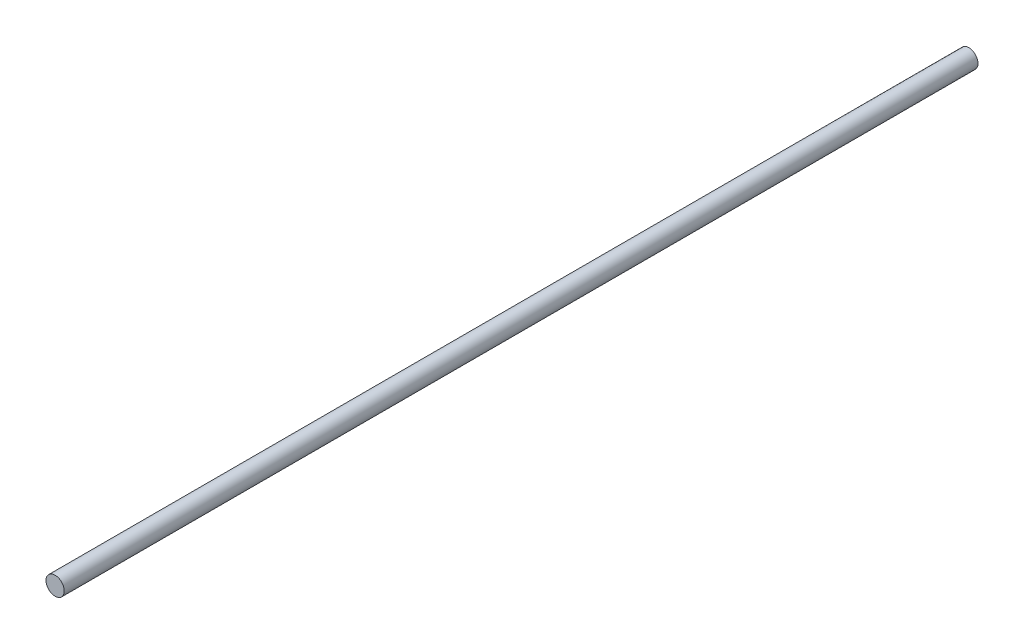
ISO-10303-21;
HEADER;
FILE_DESCRIPTION(('STEP AP214'),'2;1');
FILE_NAME('part.step','',(''),(''),'','','');
FILE_SCHEMA(('AUTOMOTIVE_DESIGN { 1 0 10303 214 1 1 1 1 }'));
ENDSEC;
DATA;
#1=APPLICATION_CONTEXT('core data for automotive mechanical design processes');
#2=APPLICATION_PROTOCOL_DEFINITION('international standard','automotive_design',2000,#1);
#3=PRODUCT_CONTEXT('',#1,'mechanical');
#4=PRODUCT('Part','Part','',(#3));
#5=PRODUCT_RELATED_PRODUCT_CATEGORY('part','',(#4));
#6=PRODUCT_DEFINITION_FORMATION('','',#4);
#7=PRODUCT_DEFINITION_CONTEXT('part definition',#1,'design');
#8=PRODUCT_DEFINITION('design','',#6,#7);
#9=PRODUCT_DEFINITION_SHAPE('','',#8);
#10=(LENGTH_UNIT() NAMED_UNIT(*) SI_UNIT(.MILLI.,.METRE.));
#11=(NAMED_UNIT(*) PLANE_ANGLE_UNIT() SI_UNIT($,.RADIAN.));
#12=(NAMED_UNIT(*) SI_UNIT($,.STERADIAN.) SOLID_ANGLE_UNIT());
#13=UNCERTAINTY_MEASURE_WITH_UNIT(LENGTH_MEASURE(1.E-05),#10,'distance_accuracy_value','');
#14=(GEOMETRIC_REPRESENTATION_CONTEXT(3) GLOBAL_UNCERTAINTY_ASSIGNED_CONTEXT((#13)) GLOBAL_UNIT_ASSIGNED_CONTEXT((#10,
#11,#12)) REPRESENTATION_CONTEXT('',''));
#15=CARTESIAN_POINT('',(0.,0.,0.));
#16=DIRECTION('',(0.,0.,1.));
#17=DIRECTION('',(1.,0.,0.));
#18=AXIS2_PLACEMENT_3D('',#15,#16,#17);
#19=CARTESIAN_POINT('',(-64.261600537996,23.2128638678067,400.));
#20=DIRECTION('',(0.,0.,-1.));
#21=DIRECTION('',(-1.,0.,0.));
#22=AXIS2_PLACEMENT_3D('',#19,#20,#21);
#23=CYLINDRICAL_SURFACE('',#22,4.00000000000001);
#24=CARTESIAN_POINT('',(-64.261600537996,23.2128638678067,400.));
#25=DIRECTION('',(0.,0.,1.));
#26=DIRECTION('',(1.,0.,0.));
#27=AXIS2_PLACEMENT_3D('',#24,#25,#26);
#28=CIRCLE('',#27,4.00000000000001);
#29=CARTESIAN_POINT('',(-60.261600537996,23.2128638678067,400.));
#30=VERTEX_POINT('',#29);
#31=EDGE_CURVE('E10',#30,#30,#28,.T.);
#32=ORIENTED_EDGE('',*,*,#31,.F.);
#33=EDGE_LOOP('',(#32));
#34=FACE_BOUND('',#33,.T.);
#35=CARTESIAN_POINT('',(-64.261600537996,23.2128638678067,0.));
#36=DIRECTION('',(0.,0.,1.));
#37=DIRECTION('',(1.,0.,0.));
#38=AXIS2_PLACEMENT_3D('',#35,#36,#37);
#39=CIRCLE('',#38,4.00000000000001);
#40=CARTESIAN_POINT('',(-60.261600537996,23.2128638678067,0.));
#41=VERTEX_POINT('',#40);
#42=EDGE_CURVE('E34',#41,#41,#39,.T.);
#43=ORIENTED_EDGE('',*,*,#42,.T.);
#44=EDGE_LOOP('',(#43));
#45=FACE_BOUND('',#44,.T.);
#46=ADVANCED_FACE('F31',(#34,#45),#23,.T.);
#47=CARTESIAN_POINT('',(-64.261600537996,23.2128638678067,400.));
#48=DIRECTION('',(0.,0.,1.));
#49=DIRECTION('',(1.,0.,0.));
#50=AXIS2_PLACEMENT_3D('',#47,#48,#49);
#51=PLANE('',#50);
#52=ORIENTED_EDGE('',*,*,#31,.T.);
#53=EDGE_LOOP('',(#52));
#54=FACE_BOUND('',#53,.T.);
#55=ADVANCED_FACE('F46',(#54),#51,.T.);
#56=CARTESIAN_POINT('',(-64.261600537996,23.2128638678067,0.));
#57=DIRECTION('',(0.,0.,1.));
#58=DIRECTION('',(1.,0.,0.));
#59=AXIS2_PLACEMENT_3D('',#56,#57,#58);
#60=PLANE('',#59);
#61=ORIENTED_EDGE('',*,*,#42,.F.);
#62=EDGE_LOOP('',(#61));
#63=FACE_BOUND('',#62,.T.);
#64=ADVANCED_FACE('F44',(#63),#60,.F.);
#65=CLOSED_SHELL('',(#46,#55,#64));
#66=MANIFOLD_SOLID_BREP('B2',#65);
#67=ADVANCED_BREP_SHAPE_REPRESENTATION('',(#18,#66),#14);
#68=SHAPE_DEFINITION_REPRESENTATION(#9,#67);
ENDSEC;
END-ISO-10303-21;
